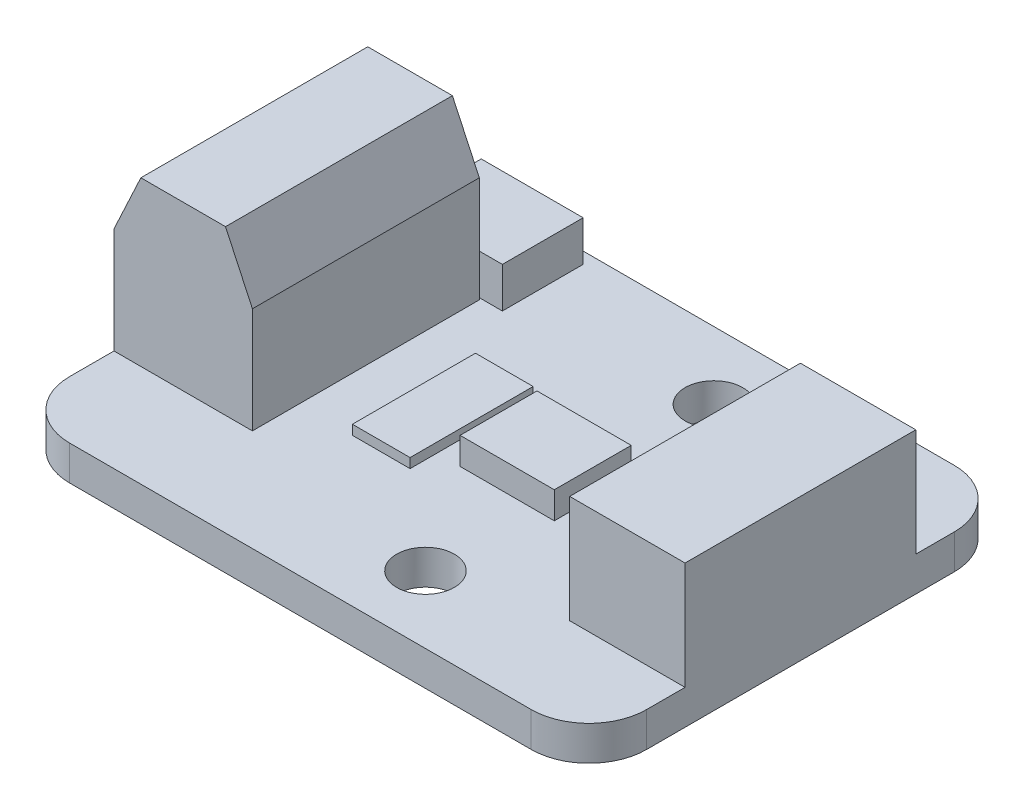
ISO-10303-21;
HEADER;
FILE_DESCRIPTION(('STEP AP214'),'2;1');
FILE_NAME('part.step','',(''),(''),'','','');
FILE_SCHEMA(('AUTOMOTIVE_DESIGN { 1 0 10303 214 1 1 1 1 }'));
ENDSEC;
DATA;
#1=APPLICATION_CONTEXT('core data for automotive mechanical design processes');
#2=APPLICATION_PROTOCOL_DEFINITION('international standard','automotive_design',2000,#1);
#3=PRODUCT_CONTEXT('',#1,'mechanical');
#4=PRODUCT('Part','Part','',(#3));
#5=PRODUCT_RELATED_PRODUCT_CATEGORY('part','',(#4));
#6=PRODUCT_DEFINITION_FORMATION('','',#4);
#7=PRODUCT_DEFINITION_CONTEXT('part definition',#1,'design');
#8=PRODUCT_DEFINITION('design','',#6,#7);
#9=PRODUCT_DEFINITION_SHAPE('','',#8);
#10=(LENGTH_UNIT() NAMED_UNIT(*) SI_UNIT(.MILLI.,.METRE.));
#11=(NAMED_UNIT(*) PLANE_ANGLE_UNIT() SI_UNIT($,.RADIAN.));
#12=(NAMED_UNIT(*) SI_UNIT($,.STERADIAN.) SOLID_ANGLE_UNIT());
#13=UNCERTAINTY_MEASURE_WITH_UNIT(LENGTH_MEASURE(1.E-05),#10,'distance_accuracy_value','');
#14=(GEOMETRIC_REPRESENTATION_CONTEXT(3) GLOBAL_UNCERTAINTY_ASSIGNED_CONTEXT((#13)) GLOBAL_UNIT_ASSIGNED_CONTEXT((#10,
#11,#12)) REPRESENTATION_CONTEXT('',''));
#15=CARTESIAN_POINT('',(0.,0.,0.));
#16=DIRECTION('',(0.,0.,1.));
#17=DIRECTION('',(1.,0.,0.));
#18=AXIS2_PLACEMENT_3D('',#15,#16,#17);
#19=CARTESIAN_POINT('',(0.,1.8,0.));
#20=DIRECTION('',(0.,-1.,0.));
#21=DIRECTION('',(0.,0.,-1.));
#22=AXIS2_PLACEMENT_3D('',#19,#20,#21);
#23=PLANE('',#22);
#24=DIRECTION('',(0.,0.,1.));
#25=VECTOR('',#24,1.);
#26=CARTESIAN_POINT('',(14.2,1.8,-13.1));
#27=LINE('',#26,#25);
#28=CARTESIAN_POINT('',(14.2,1.8,-13.1));
#29=VERTEX_POINT('',#28);
#30=CARTESIAN_POINT('',(14.2,1.8,-9.1));
#31=VERTEX_POINT('',#30);
#32=EDGE_CURVE('E262',#29,#31,#27,.T.);
#33=ORIENTED_EDGE('',*,*,#32,.F.);
#34=DIRECTION('',(-1.,0.,0.));
#35=VECTOR('',#34,1.);
#36=CARTESIAN_POINT('',(14.2,1.8,-13.1));
#37=LINE('',#36,#35);
#38=CARTESIAN_POINT('',(19.1,1.8,-13.1));
#39=VERTEX_POINT('',#38);
#40=EDGE_CURVE('E275',#39,#29,#37,.T.);
#41=ORIENTED_EDGE('',*,*,#40,.F.);
#42=DIRECTION('',(0.,0.,-1.));
#43=VECTOR('',#42,1.);
#44=CARTESIAN_POINT('',(19.1,1.8,-13.1));
#45=LINE('',#44,#43);
#46=CARTESIAN_POINT('',(19.1,1.8,-9.1));
#47=VERTEX_POINT('',#46);
#48=EDGE_CURVE('E284',#47,#39,#45,.T.);
#49=ORIENTED_EDGE('',*,*,#48,.F.);
#50=DIRECTION('',(1.,0.,0.));
#51=VECTOR('',#50,1.);
#52=CARTESIAN_POINT('',(14.2,1.8,-9.1));
#53=LINE('',#52,#51);
#54=EDGE_CURVE('E265',#31,#47,#53,.T.);
#55=ORIENTED_EDGE('',*,*,#54,.F.);
#56=EDGE_LOOP('',(#33,#41,#49,#55));
#57=FACE_BOUND('',#56,.T.);
#58=DIRECTION('',(-1.,0.,0.));
#59=VECTOR('',#58,1.);
#60=CARTESIAN_POINT('',(0.,1.8,-22.));
#61=LINE('',#60,#59);
#62=CARTESIAN_POINT('',(27.,1.8,-22.));
#63=VERTEX_POINT('',#62);
#64=CARTESIAN_POINT('',(3.,1.8,-22.));
#65=VERTEX_POINT('',#64);
#66=EDGE_CURVE('E409',#63,#65,#61,.T.);
#67=ORIENTED_EDGE('',*,*,#66,.T.);
#68=CARTESIAN_POINT('',(3.,1.8,-19.));
#69=DIRECTION('',(0.,-1.,0.));
#70=DIRECTION('',(0.,0.,-1.));
#71=AXIS2_PLACEMENT_3D('',#68,#69,#70);
#72=CIRCLE('',#71,3.);
#73=CARTESIAN_POINT('',(0.,1.8,-19.));
#74=VERTEX_POINT('',#73);
#75=EDGE_CURVE('E447',#65,#74,#72,.F.);
#76=ORIENTED_EDGE('',*,*,#75,.T.);
#77=DIRECTION('',(0.,0.,1.));
#78=VECTOR('',#77,1.);
#79=CARTESIAN_POINT('',(0.,1.8,0.));
#80=LINE('',#79,#78);
#81=CARTESIAN_POINT('',(0.,1.8,-17.1));
#82=VERTEX_POINT('',#81);
#83=EDGE_CURVE('E399',#74,#82,#80,.T.);
#84=ORIENTED_EDGE('',*,*,#83,.T.);
#85=DIRECTION('',(-1.,0.,0.));
#86=VECTOR('',#85,1.);
#87=CARTESIAN_POINT('',(0.,1.8,-17.1));
#88=LINE('',#87,#86);
#89=CARTESIAN_POINT('',(7.2,1.8,-17.1));
#90=VERTEX_POINT('',#89);
#91=EDGE_CURVE('E368',#90,#82,#88,.T.);
#92=ORIENTED_EDGE('',*,*,#91,.F.);
#93=DIRECTION('',(0.,0.,-1.));
#94=VECTOR('',#93,1.);
#95=CARTESIAN_POINT('',(7.2,1.8,-17.1));
#96=LINE('',#95,#94);
#97=CARTESIAN_POINT('',(7.2,1.8,-5.3));
#98=VERTEX_POINT('',#97);
#99=EDGE_CURVE('E374',#98,#90,#96,.T.);
#100=ORIENTED_EDGE('',*,*,#99,.F.);
#101=DIRECTION('',(1.,0.,0.));
#102=VECTOR('',#101,1.);
#103=CARTESIAN_POINT('',(0.,1.8,-5.3));
#104=LINE('',#103,#102);
#105=CARTESIAN_POINT('',(0.,1.8,-5.3));
#106=VERTEX_POINT('',#105);
#107=EDGE_CURVE('E363',#106,#98,#104,.T.);
#108=ORIENTED_EDGE('',*,*,#107,.F.);
#109=CARTESIAN_POINT('',(0.,1.8,-3.));
#110=VERTEX_POINT('',#109);
#111=EDGE_CURVE('E403',#106,#110,#80,.T.);
#112=ORIENTED_EDGE('',*,*,#111,.T.);
#113=CARTESIAN_POINT('',(3.,1.8,-3.));
#114=DIRECTION('',(0.,-1.,0.));
#115=DIRECTION('',(0.,0.,-1.));
#116=AXIS2_PLACEMENT_3D('',#113,#114,#115);
#117=CIRCLE('',#116,3.);
#118=CARTESIAN_POINT('',(3.,1.8,0.));
#119=VERTEX_POINT('',#118);
#120=EDGE_CURVE('E441',#110,#119,#117,.F.);
#121=ORIENTED_EDGE('',*,*,#120,.T.);
#122=DIRECTION('',(1.,0.,0.));
#123=VECTOR('',#122,1.);
#124=CARTESIAN_POINT('',(0.,1.8,0.));
#125=LINE('',#124,#123);
#126=CARTESIAN_POINT('',(27.,1.8,0.));
#127=VERTEX_POINT('',#126);
#128=EDGE_CURVE('E402',#119,#127,#125,.T.);
#129=ORIENTED_EDGE('',*,*,#128,.T.);
#130=CARTESIAN_POINT('',(27.,1.8,-3.));
#131=DIRECTION('',(0.,-1.,0.));
#132=DIRECTION('',(0.,0.,-1.));
#133=AXIS2_PLACEMENT_3D('',#130,#131,#132);
#134=CIRCLE('',#133,3.);
#135=CARTESIAN_POINT('',(30.,1.8,-3.));
#136=VERTEX_POINT('',#135);
#137=EDGE_CURVE('E443',#127,#136,#134,.F.);
#138=ORIENTED_EDGE('',*,*,#137,.T.);
#139=DIRECTION('',(0.,0.,-1.));
#140=VECTOR('',#139,1.);
#141=CARTESIAN_POINT('',(30.,1.8,0.));
#142=LINE('',#141,#140);
#143=CARTESIAN_POINT('',(30.,1.8,-5.));
#144=VERTEX_POINT('',#143);
#145=EDGE_CURVE('E407',#136,#144,#142,.T.);
#146=ORIENTED_EDGE('',*,*,#145,.T.);
#147=DIRECTION('',(1.,0.,0.));
#148=VECTOR('',#147,1.);
#149=CARTESIAN_POINT('',(24.,1.8,-5.));
#150=LINE('',#149,#148);
#151=CARTESIAN_POINT('',(24.,1.8,-5.));
#152=VERTEX_POINT('',#151);
#153=EDGE_CURVE('E347',#152,#144,#150,.T.);
#154=ORIENTED_EDGE('',*,*,#153,.F.);
#155=DIRECTION('',(0.,0.,1.));
#156=VECTOR('',#155,1.);
#157=CARTESIAN_POINT('',(24.,1.8,-17.));
#158=LINE('',#157,#156);
#159=CARTESIAN_POINT('',(24.,1.8,-17.));
#160=VERTEX_POINT('',#159);
#161=EDGE_CURVE('E333',#160,#152,#158,.T.);
#162=ORIENTED_EDGE('',*,*,#161,.F.);
#163=DIRECTION('',(-1.,0.,0.));
#164=VECTOR('',#163,1.);
#165=CARTESIAN_POINT('',(24.,1.8,-17.));
#166=LINE('',#165,#164);
#167=CARTESIAN_POINT('',(30.,1.8,-17.));
#168=VERTEX_POINT('',#167);
#169=EDGE_CURVE('E338',#168,#160,#166,.T.);
#170=ORIENTED_EDGE('',*,*,#169,.F.);
#171=CARTESIAN_POINT('',(30.,1.8,-19.));
#172=VERTEX_POINT('',#171);
#173=EDGE_CURVE('E406',#168,#172,#142,.T.);
#174=ORIENTED_EDGE('',*,*,#173,.T.);
#175=CARTESIAN_POINT('',(27.,1.8,-19.));
#176=DIRECTION('',(0.,-1.,0.));
#177=DIRECTION('',(0.,0.,-1.));
#178=AXIS2_PLACEMENT_3D('',#175,#176,#177);
#179=CIRCLE('',#178,3.);
#180=EDGE_CURVE('E445',#172,#63,#179,.F.);
#181=ORIENTED_EDGE('',*,*,#180,.T.);
#182=EDGE_LOOP('',(#67,#76,#84,#92,#100,#108,#112,#121,#129,#138,#146,#154,#162,#170,#174,#181));
#183=FACE_BOUND('',#182,.T.);
#184=CARTESIAN_POINT('',(18.,1.8,-3.5));
#185=DIRECTION('',(0.,1.,0.));
#186=DIRECTION('',(0.,0.,1.));
#187=AXIS2_PLACEMENT_3D('',#184,#185,#186);
#188=CIRCLE('',#187,1.5);
#189=CARTESIAN_POINT('',(18.,1.8,-2.));
#190=VERTEX_POINT('',#189);
#191=EDGE_CURVE('E391',#190,#190,#188,.T.);
#192=ORIENTED_EDGE('',*,*,#191,.F.);
#193=EDGE_LOOP('',(#192));
#194=FACE_BOUND('',#193,.T.);
#195=CARTESIAN_POINT('',(18.,1.8,-18.5));
#196=DIRECTION('',(0.,1.,0.));
#197=DIRECTION('',(0.,0.,1.));
#198=AXIS2_PLACEMENT_3D('',#195,#196,#197);
#199=CIRCLE('',#198,1.5);
#200=CARTESIAN_POINT('',(18.,1.8,-17.));
#201=VERTEX_POINT('',#200);
#202=EDGE_CURVE('E387',#201,#201,#199,.T.);
#203=ORIENTED_EDGE('',*,*,#202,.F.);
#204=EDGE_LOOP('',(#203));
#205=FACE_BOUND('',#204,.T.);
#206=DIRECTION('',(0.,0.,1.));
#207=VECTOR('',#206,1.);
#208=CARTESIAN_POINT('',(3.,1.8,-21.4));
#209=LINE('',#208,#207);
#210=CARTESIAN_POINT('',(3.,1.8,-21.4));
#211=VERTEX_POINT('',#210);
#212=CARTESIAN_POINT('',(3.,1.8,-17.2));
#213=VERTEX_POINT('',#212);
#214=EDGE_CURVE('E300',#211,#213,#209,.T.);
#215=ORIENTED_EDGE('',*,*,#214,.F.);
#216=DIRECTION('',(-1.,0.,0.));
#217=VECTOR('',#216,1.);
#218=CARTESIAN_POINT('',(3.,1.8,-21.4));
#219=LINE('',#218,#217);
#220=CARTESIAN_POINT('',(8.3,1.8,-21.4));
#221=VERTEX_POINT('',#220);
#222=EDGE_CURVE('E305',#221,#211,#219,.T.);
#223=ORIENTED_EDGE('',*,*,#222,.F.);
#224=DIRECTION('',(0.,0.,-1.));
#225=VECTOR('',#224,1.);
#226=CARTESIAN_POINT('',(8.3,1.8,-21.4));
#227=LINE('',#226,#225);
#228=CARTESIAN_POINT('',(8.3,1.8,-17.2));
#229=VERTEX_POINT('',#228);
#230=EDGE_CURVE('E317',#229,#221,#227,.T.);
#231=ORIENTED_EDGE('',*,*,#230,.F.);
#232=DIRECTION('',(1.,0.,0.));
#233=VECTOR('',#232,1.);
#234=CARTESIAN_POINT('',(3.,1.8,-17.2));
#235=LINE('',#234,#233);
#236=EDGE_CURVE('E314',#213,#229,#235,.T.);
#237=ORIENTED_EDGE('',*,*,#236,.F.);
#238=EDGE_LOOP('',(#215,#223,#231,#237));
#239=FACE_BOUND('',#238,.T.);
#240=DIRECTION('',(0.,0.,1.));
#241=VECTOR('',#240,1.);
#242=CARTESIAN_POINT('',(10.,1.8,-14.1));
#243=LINE('',#242,#241);
#244=CARTESIAN_POINT('',(10.,1.8,-14.1));
#245=VERTEX_POINT('',#244);
#246=CARTESIAN_POINT('',(10.,1.8,-7.7));
#247=VERTEX_POINT('',#246);
#248=EDGE_CURVE('E261',#245,#247,#243,.T.);
#249=ORIENTED_EDGE('',*,*,#248,.F.);
#250=DIRECTION('',(-1.,0.,0.));
#251=VECTOR('',#250,1.);
#252=CARTESIAN_POINT('',(10.,1.8,-14.1));
#253=LINE('',#252,#251);
#254=CARTESIAN_POINT('',(13.,1.8,-14.1));
#255=VERTEX_POINT('',#254);
#256=EDGE_CURVE('E258',#255,#245,#253,.T.);
#257=ORIENTED_EDGE('',*,*,#256,.F.);
#258=DIRECTION('',(0.,0.,-1.));
#259=VECTOR('',#258,1.);
#260=CARTESIAN_POINT('',(13.,1.8,-14.1));
#261=LINE('',#260,#259);
#262=CARTESIAN_POINT('',(13.,1.8,-7.7));
#263=VERTEX_POINT('',#262);
#264=EDGE_CURVE('E954',#263,#255,#261,.T.);
#265=ORIENTED_EDGE('',*,*,#264,.F.);
#266=DIRECTION('',(1.,0.,0.));
#267=VECTOR('',#266,1.);
#268=CARTESIAN_POINT('',(10.,1.8,-7.7));
#269=LINE('',#268,#267);
#270=EDGE_CURVE('E960',#247,#263,#269,.T.);
#271=ORIENTED_EDGE('',*,*,#270,.F.);
#272=EDGE_LOOP('',(#249,#257,#265,#271));
#273=FACE_BOUND('',#272,.T.);
#274=ADVANCED_FACE('F39',(#57,#183,#194,#205,#239,#273),#23,.F.);
#275=CARTESIAN_POINT('',(0.,1.8,0.));
#276=DIRECTION('',(1.,0.,0.));
#277=DIRECTION('',(0.,0.,-1.));
#278=AXIS2_PLACEMENT_3D('',#275,#276,#277);
#279=PLANE('',#278);
#280=DIRECTION('',(0.,-1.,0.));
#281=VECTOR('',#280,1.);
#282=CARTESIAN_POINT('',(0.,10.3,-5.3));
#283=LINE('',#282,#281);
#284=CARTESIAN_POINT('',(0.,7.29999999999997,-5.3));
#285=VERTEX_POINT('',#284);
#286=EDGE_CURVE('E384',#285,#106,#283,.T.);
#287=ORIENTED_EDGE('',*,*,#286,.F.);
#288=DIRECTION('',(0.,0.,-1.));
#289=VECTOR('',#288,1.);
#290=CARTESIAN_POINT('',(0.,7.29999999999997,-17.1));
#291=LINE('',#290,#289);
#292=CARTESIAN_POINT('',(0.,7.29999999999997,-17.1));
#293=VERTEX_POINT('',#292);
#294=EDGE_CURVE('E11',#285,#293,#291,.T.);
#295=ORIENTED_EDGE('',*,*,#294,.T.);
#296=DIRECTION('',(0.,-1.,0.));
#297=VECTOR('',#296,1.);
#298=CARTESIAN_POINT('',(0.,10.3,-17.1));
#299=LINE('',#298,#297);
#300=EDGE_CURVE('E371',#293,#82,#299,.T.);
#301=ORIENTED_EDGE('',*,*,#300,.T.);
#302=ORIENTED_EDGE('',*,*,#83,.F.);
#303=DIRECTION('',(0.,-1.,0.));
#304=VECTOR('',#303,1.);
#305=CARTESIAN_POINT('',(0.,1.8,-19.));
#306=LINE('',#305,#304);
#307=CARTESIAN_POINT('',(0.,0.,-19.));
#308=VERTEX_POINT('',#307);
#309=EDGE_CURVE('E425',#74,#308,#306,.T.);
#310=ORIENTED_EDGE('',*,*,#309,.T.);
#311=DIRECTION('',(0.,0.,1.));
#312=VECTOR('',#311,1.);
#313=CARTESIAN_POINT('',(0.,0.,0.));
#314=LINE('',#313,#312);
#315=CARTESIAN_POINT('',(0.,0.,-3.));
#316=VERTEX_POINT('',#315);
#317=EDGE_CURVE('E394',#308,#316,#314,.T.);
#318=ORIENTED_EDGE('',*,*,#317,.T.);
#319=DIRECTION('',(0.,-1.,0.));
#320=VECTOR('',#319,1.);
#321=CARTESIAN_POINT('',(0.,1.8,-3.));
#322=LINE('',#321,#320);
#323=EDGE_CURVE('E412',#316,#110,#322,.F.);
#324=ORIENTED_EDGE('',*,*,#323,.T.);
#325=ORIENTED_EDGE('',*,*,#111,.F.);
#326=EDGE_LOOP('',(#287,#295,#301,#302,#310,#318,#324,#325));
#327=FACE_BOUND('',#326,.T.);
#328=ADVANCED_FACE('F491',(#327),#279,.F.);
#329=CARTESIAN_POINT('',(0.,1.8,0.));
#330=DIRECTION('',(0.,0.,-1.));
#331=DIRECTION('',(-1.,0.,0.));
#332=AXIS2_PLACEMENT_3D('',#329,#330,#331);
#333=PLANE('',#332);
#334=DIRECTION('',(1.,0.,0.));
#335=VECTOR('',#334,1.);
#336=CARTESIAN_POINT('',(0.,0.,0.));
#337=LINE('',#336,#335);
#338=CARTESIAN_POINT('',(3.,0.,0.));
#339=VERTEX_POINT('',#338);
#340=CARTESIAN_POINT('',(27.,0.,0.));
#341=VERTEX_POINT('',#340);
#342=EDGE_CURVE('E415',#339,#341,#337,.T.);
#343=ORIENTED_EDGE('',*,*,#342,.T.);
#344=DIRECTION('',(0.,-1.,0.));
#345=VECTOR('',#344,1.);
#346=CARTESIAN_POINT('',(27.,1.8,0.));
#347=LINE('',#346,#345);
#348=EDGE_CURVE('E457',#341,#127,#347,.F.);
#349=ORIENTED_EDGE('',*,*,#348,.T.);
#350=ORIENTED_EDGE('',*,*,#128,.F.);
#351=DIRECTION('',(0.,-1.,0.));
#352=VECTOR('',#351,1.);
#353=CARTESIAN_POINT('',(3.,1.8,0.));
#354=LINE('',#353,#352);
#355=EDGE_CURVE('E454',#119,#339,#354,.T.);
#356=ORIENTED_EDGE('',*,*,#355,.T.);
#357=EDGE_LOOP('',(#343,#349,#350,#356));
#358=FACE_BOUND('',#357,.T.);
#359=ADVANCED_FACE('F514',(#358),#333,.F.);
#360=CARTESIAN_POINT('',(30.,1.8,0.));
#361=DIRECTION('',(-1.,0.,0.));
#362=DIRECTION('',(0.,0.,1.));
#363=AXIS2_PLACEMENT_3D('',#360,#361,#362);
#364=PLANE('',#363);
#365=DIRECTION('',(0.,0.,-1.));
#366=VECTOR('',#365,1.);
#367=CARTESIAN_POINT('',(30.,0.,0.));
#368=LINE('',#367,#366);
#369=CARTESIAN_POINT('',(30.,0.,-3.));
#370=VERTEX_POINT('',#369);
#371=CARTESIAN_POINT('',(30.,0.,-19.));
#372=VERTEX_POINT('',#371);
#373=EDGE_CURVE('E418',#370,#372,#368,.T.);
#374=ORIENTED_EDGE('',*,*,#373,.T.);
#375=DIRECTION('',(0.,-1.,0.));
#376=VECTOR('',#375,1.);
#377=CARTESIAN_POINT('',(30.,1.8,-19.));
#378=LINE('',#377,#376);
#379=EDGE_CURVE('E452',#372,#172,#378,.F.);
#380=ORIENTED_EDGE('',*,*,#379,.T.);
#381=ORIENTED_EDGE('',*,*,#173,.F.);
#382=DIRECTION('',(0.,-1.,0.));
#383=VECTOR('',#382,1.);
#384=CARTESIAN_POINT('',(30.,7.4,-17.));
#385=LINE('',#384,#383);
#386=CARTESIAN_POINT('',(30.,7.4,-17.));
#387=VERTEX_POINT('',#386);
#388=EDGE_CURVE('E354',#387,#168,#385,.T.);
#389=ORIENTED_EDGE('',*,*,#388,.F.);
#390=DIRECTION('',(0.,0.,-1.));
#391=VECTOR('',#390,1.);
#392=CARTESIAN_POINT('',(30.,7.4,-17.));
#393=LINE('',#392,#391);
#394=CARTESIAN_POINT('',(30.,7.4,-5.));
#395=VERTEX_POINT('',#394);
#396=EDGE_CURVE('E340',#395,#387,#393,.T.);
#397=ORIENTED_EDGE('',*,*,#396,.F.);
#398=DIRECTION('',(0.,-1.,0.));
#399=VECTOR('',#398,1.);
#400=CARTESIAN_POINT('',(30.,7.4,-5.));
#401=LINE('',#400,#399);
#402=EDGE_CURVE('E357',#395,#144,#401,.T.);
#403=ORIENTED_EDGE('',*,*,#402,.T.);
#404=ORIENTED_EDGE('',*,*,#145,.F.);
#405=DIRECTION('',(0.,-1.,0.));
#406=VECTOR('',#405,1.);
#407=CARTESIAN_POINT('',(30.,1.8,-3.));
#408=LINE('',#407,#406);
#409=EDGE_CURVE('E449',#136,#370,#408,.T.);
#410=ORIENTED_EDGE('',*,*,#409,.T.);
#411=EDGE_LOOP('',(#374,#380,#381,#389,#397,#403,#404,#410));
#412=FACE_BOUND('',#411,.T.);
#413=ADVANCED_FACE('F523',(#412),#364,.F.);
#414=CARTESIAN_POINT('',(0.,1.8,-22.));
#415=DIRECTION('',(0.,0.,1.));
#416=DIRECTION('',(1.,0.,0.));
#417=AXIS2_PLACEMENT_3D('',#414,#415,#416);
#418=PLANE('',#417);
#419=DIRECTION('',(-1.,0.,0.));
#420=VECTOR('',#419,1.);
#421=CARTESIAN_POINT('',(0.,0.,-22.));
#422=LINE('',#421,#420);
#423=CARTESIAN_POINT('',(27.,0.,-22.));
#424=VERTEX_POINT('',#423);
#425=CARTESIAN_POINT('',(3.,0.,-22.));
#426=VERTEX_POINT('',#425);
#427=EDGE_CURVE('E421',#424,#426,#422,.T.);
#428=ORIENTED_EDGE('',*,*,#427,.T.);
#429=DIRECTION('',(0.,-1.,0.));
#430=VECTOR('',#429,1.);
#431=CARTESIAN_POINT('',(3.,1.8,-22.));
#432=LINE('',#431,#430);
#433=EDGE_CURVE('E439',#426,#65,#432,.F.);
#434=ORIENTED_EDGE('',*,*,#433,.T.);
#435=ORIENTED_EDGE('',*,*,#66,.F.);
#436=DIRECTION('',(0.,-1.,0.));
#437=VECTOR('',#436,1.);
#438=CARTESIAN_POINT('',(27.,1.8,-22.));
#439=LINE('',#438,#437);
#440=EDGE_CURVE('E436',#63,#424,#439,.T.);
#441=ORIENTED_EDGE('',*,*,#440,.T.);
#442=EDGE_LOOP('',(#428,#434,#435,#441));
#443=FACE_BOUND('',#442,.T.);
#444=ADVANCED_FACE('F530',(#443),#418,.F.);
#445=CARTESIAN_POINT('',(0.,0.,0.));
#446=DIRECTION('',(0.,-1.,0.));
#447=DIRECTION('',(0.,0.,-1.));
#448=AXIS2_PLACEMENT_3D('',#445,#446,#447);
#449=PLANE('',#448);
#450=CARTESIAN_POINT('',(18.,0.,-18.5));
#451=DIRECTION('',(0.,-1.,0.));
#452=DIRECTION('',(0.,0.,-1.));
#453=AXIS2_PLACEMENT_3D('',#450,#451,#452);
#454=CIRCLE('',#453,1.5);
#455=CARTESIAN_POINT('',(18.,0.,-20.));
#456=VERTEX_POINT('',#455);
#457=EDGE_CURVE('E390',#456,#456,#454,.F.);
#458=ORIENTED_EDGE('',*,*,#457,.T.);
#459=EDGE_LOOP('',(#458));
#460=FACE_BOUND('',#459,.T.);
#461=CARTESIAN_POINT('',(18.,0.,-3.5));
#462=DIRECTION('',(0.,-1.,0.));
#463=DIRECTION('',(0.,0.,-1.));
#464=AXIS2_PLACEMENT_3D('',#461,#462,#463);
#465=CIRCLE('',#464,1.5);
#466=CARTESIAN_POINT('',(18.,0.,-5.));
#467=VERTEX_POINT('',#466);
#468=EDGE_CURVE('E386',#467,#467,#465,.F.);
#469=ORIENTED_EDGE('',*,*,#468,.T.);
#470=EDGE_LOOP('',(#469));
#471=FACE_BOUND('',#470,.T.);
#472=ORIENTED_EDGE('',*,*,#317,.F.);
#473=CARTESIAN_POINT('',(3.,0.,-19.));
#474=DIRECTION('',(0.,-1.,0.));
#475=DIRECTION('',(0.,0.,-1.));
#476=AXIS2_PLACEMENT_3D('',#473,#474,#475);
#477=CIRCLE('',#476,3.);
#478=EDGE_CURVE('E434',#308,#426,#477,.T.);
#479=ORIENTED_EDGE('',*,*,#478,.T.);
#480=ORIENTED_EDGE('',*,*,#427,.F.);
#481=CARTESIAN_POINT('',(27.,0.,-19.));
#482=DIRECTION('',(0.,-1.,0.));
#483=DIRECTION('',(0.,0.,-1.));
#484=AXIS2_PLACEMENT_3D('',#481,#482,#483);
#485=CIRCLE('',#484,3.);
#486=EDGE_CURVE('E432',#424,#372,#485,.T.);
#487=ORIENTED_EDGE('',*,*,#486,.T.);
#488=ORIENTED_EDGE('',*,*,#373,.F.);
#489=CARTESIAN_POINT('',(27.,0.,-3.));
#490=DIRECTION('',(0.,-1.,0.));
#491=DIRECTION('',(0.,0.,-1.));
#492=AXIS2_PLACEMENT_3D('',#489,#490,#491);
#493=CIRCLE('',#492,3.);
#494=EDGE_CURVE('E430',#370,#341,#493,.T.);
#495=ORIENTED_EDGE('',*,*,#494,.T.);
#496=ORIENTED_EDGE('',*,*,#342,.F.);
#497=CARTESIAN_POINT('',(3.,0.,-3.));
#498=DIRECTION('',(0.,-1.,0.));
#499=DIRECTION('',(0.,0.,-1.));
#500=AXIS2_PLACEMENT_3D('',#497,#498,#499);
#501=CIRCLE('',#500,3.);
#502=EDGE_CURVE('E428',#339,#316,#501,.T.);
#503=ORIENTED_EDGE('',*,*,#502,.T.);
#504=EDGE_LOOP('',(#472,#479,#480,#487,#488,#495,#496,#503));
#505=FACE_BOUND('',#504,.T.);
#506=ADVANCED_FACE('F505',(#460,#471,#505),#449,.T.);
#507=CARTESIAN_POINT('',(18.,-4.24264068711929,-3.5));
#508=DIRECTION('',(0.,1.,0.));
#509=DIRECTION('',(0.,0.,1.));
#510=AXIS2_PLACEMENT_3D('',#507,#508,#509);
#511=CYLINDRICAL_SURFACE('',#510,1.5);
#512=ORIENTED_EDGE('',*,*,#191,.T.);
#513=EDGE_LOOP('',(#512));
#514=FACE_BOUND('',#513,.T.);
#515=ORIENTED_EDGE('',*,*,#468,.F.);
#516=EDGE_LOOP('',(#515));
#517=FACE_BOUND('',#516,.T.);
#518=ADVANCED_FACE('F537',(#514,#517),#511,.F.);
#519=CARTESIAN_POINT('',(18.,-4.24264068711929,-18.5));
#520=DIRECTION('',(0.,1.,0.));
#521=DIRECTION('',(0.,0.,1.));
#522=AXIS2_PLACEMENT_3D('',#519,#520,#521);
#523=CYLINDRICAL_SURFACE('',#522,1.5);
#524=ORIENTED_EDGE('',*,*,#202,.T.);
#525=EDGE_LOOP('',(#524));
#526=FACE_BOUND('',#525,.T.);
#527=ORIENTED_EDGE('',*,*,#457,.F.);
#528=EDGE_LOOP('',(#527));
#529=FACE_BOUND('',#528,.T.);
#530=ADVANCED_FACE('F551',(#526,#529),#523,.F.);
#531=CARTESIAN_POINT('',(0.,10.3,-5.3));
#532=DIRECTION('',(0.,0.,-1.));
#533=DIRECTION('',(-1.,0.,0.));
#534=AXIS2_PLACEMENT_3D('',#531,#532,#533);
#535=PLANE('',#534);
#536=DIRECTION('',(0.,-1.,0.));
#537=VECTOR('',#536,1.);
#538=CARTESIAN_POINT('',(7.2,10.3,-5.3));
#539=LINE('',#538,#537);
#540=CARTESIAN_POINT('',(7.2,7.29999999999998,-5.3));
#541=VERTEX_POINT('',#540);
#542=EDGE_CURVE('E382',#541,#98,#539,.T.);
#543=ORIENTED_EDGE('',*,*,#542,.F.);
#544=DIRECTION('',(-0.422618261740697,0.906307787036651,0.));
#545=VECTOR('',#544,1.);
#546=CARTESIAN_POINT('',(5.80107702553501,10.3,-5.3));
#547=LINE('',#546,#545);
#548=CARTESIAN_POINT('',(5.80107702553501,10.3,-5.3));
#549=VERTEX_POINT('',#548);
#550=EDGE_CURVE('E48',#541,#549,#547,.T.);
#551=ORIENTED_EDGE('',*,*,#550,.T.);
#552=DIRECTION('',(1.,0.,0.));
#553=VECTOR('',#552,1.);
#554=CARTESIAN_POINT('',(0.,10.3,-5.3));
#555=LINE('',#554,#553);
#556=CARTESIAN_POINT('',(1.398922974465,10.3,-5.3));
#557=VERTEX_POINT('',#556);
#558=EDGE_CURVE('E364',#557,#549,#555,.T.);
#559=ORIENTED_EDGE('',*,*,#558,.F.);
#560=DIRECTION('',(-0.422618261740697,-0.906307787036651,0.));
#561=VECTOR('',#560,1.);
#562=CARTESIAN_POINT('',(1.398922974465,10.3,-5.3));
#563=LINE('',#562,#561);
#564=EDGE_CURVE('E55',#557,#285,#563,.T.);
#565=ORIENTED_EDGE('',*,*,#564,.T.);
#566=ORIENTED_EDGE('',*,*,#286,.T.);
#567=ORIENTED_EDGE('',*,*,#107,.T.);
#568=EDGE_LOOP('',(#543,#551,#559,#565,#566,#567));
#569=FACE_BOUND('',#568,.T.);
#570=ADVANCED_FACE('F471',(#569),#535,.F.);
#571=CARTESIAN_POINT('',(7.2,10.3,-17.1));
#572=DIRECTION('',(-1.,0.,0.));
#573=DIRECTION('',(0.,0.,1.));
#574=AXIS2_PLACEMENT_3D('',#571,#572,#573);
#575=PLANE('',#574);
#576=DIRECTION('',(0.,-1.,0.));
#577=VECTOR('',#576,1.);
#578=CARTESIAN_POINT('',(7.2,10.3,-17.1));
#579=LINE('',#578,#577);
#580=CARTESIAN_POINT('',(7.2,7.29999999999998,-17.1));
#581=VERTEX_POINT('',#580);
#582=EDGE_CURVE('E380',#581,#90,#579,.T.);
#583=ORIENTED_EDGE('',*,*,#582,.F.);
#584=DIRECTION('',(0.,0.,1.));
#585=VECTOR('',#584,1.);
#586=CARTESIAN_POINT('',(7.2,7.29999999999998,-5.3));
#587=LINE('',#586,#585);
#588=EDGE_CURVE('E63',#581,#541,#587,.T.);
#589=ORIENTED_EDGE('',*,*,#588,.T.);
#590=ORIENTED_EDGE('',*,*,#542,.T.);
#591=ORIENTED_EDGE('',*,*,#99,.T.);
#592=EDGE_LOOP('',(#583,#589,#590,#591));
#593=FACE_BOUND('',#592,.T.);
#594=ADVANCED_FACE('F482',(#593),#575,.F.);
#595=CARTESIAN_POINT('',(0.,10.3,-17.1));
#596=DIRECTION('',(0.,0.,1.));
#597=DIRECTION('',(1.,0.,0.));
#598=AXIS2_PLACEMENT_3D('',#595,#596,#597);
#599=PLANE('',#598);
#600=DIRECTION('',(-1.,0.,0.));
#601=VECTOR('',#600,1.);
#602=CARTESIAN_POINT('',(0.,10.3,-17.1));
#603=LINE('',#602,#601);
#604=CARTESIAN_POINT('',(5.801077025535,10.3,-17.1));
#605=VERTEX_POINT('',#604);
#606=CARTESIAN_POINT('',(1.398922974465,10.3,-17.1));
#607=VERTEX_POINT('',#606);
#608=EDGE_CURVE('E367',#605,#607,#603,.T.);
#609=ORIENTED_EDGE('',*,*,#608,.F.);
#610=DIRECTION('',(0.422618261740697,-0.906307787036651,0.));
#611=VECTOR('',#610,1.);
#612=CARTESIAN_POINT('',(5.80107702553501,10.3,-17.1));
#613=LINE('',#612,#611);
#614=EDGE_CURVE('E467',#605,#581,#613,.T.);
#615=ORIENTED_EDGE('',*,*,#614,.T.);
#616=ORIENTED_EDGE('',*,*,#582,.T.);
#617=ORIENTED_EDGE('',*,*,#91,.T.);
#618=ORIENTED_EDGE('',*,*,#300,.F.);
#619=DIRECTION('',(0.422618261740697,0.906307787036651,0.));
#620=VECTOR('',#619,1.);
#621=CARTESIAN_POINT('',(1.398922974465,10.3,-17.1));
#622=LINE('',#621,#620);
#623=EDGE_CURVE('E465',#293,#607,#622,.T.);
#624=ORIENTED_EDGE('',*,*,#623,.T.);
#625=EDGE_LOOP('',(#609,#615,#616,#617,#618,#624));
#626=FACE_BOUND('',#625,.T.);
#627=ADVANCED_FACE('F480',(#626),#599,.F.);
#628=CARTESIAN_POINT('',(0.,10.3,0.));
#629=DIRECTION('',(0.,1.,0.));
#630=DIRECTION('',(0.,0.,1.));
#631=AXIS2_PLACEMENT_3D('',#628,#629,#630);
#632=PLANE('',#631);
#633=ORIENTED_EDGE('',*,*,#558,.T.);
#634=DIRECTION('',(0.,0.,-1.));
#635=VECTOR('',#634,1.);
#636=CARTESIAN_POINT('',(5.801077025535,10.3,-17.1));
#637=LINE('',#636,#635);
#638=EDGE_CURVE('E462',#549,#605,#637,.T.);
#639=ORIENTED_EDGE('',*,*,#638,.T.);
#640=ORIENTED_EDGE('',*,*,#608,.T.);
#641=DIRECTION('',(0.,0.,1.));
#642=VECTOR('',#641,1.);
#643=CARTESIAN_POINT('',(1.398922974465,10.3,-5.3));
#644=LINE('',#643,#642);
#645=EDGE_CURVE('E459',#607,#557,#644,.T.);
#646=ORIENTED_EDGE('',*,*,#645,.T.);
#647=EDGE_LOOP('',(#633,#639,#640,#646));
#648=FACE_BOUND('',#647,.T.);
#649=ADVANCED_FACE('F475',(#648),#632,.T.);
#650=CARTESIAN_POINT('',(24.,7.4,-17.));
#651=DIRECTION('',(1.,0.,0.));
#652=DIRECTION('',(0.,0.,-1.));
#653=AXIS2_PLACEMENT_3D('',#650,#651,#652);
#654=PLANE('',#653);
#655=ORIENTED_EDGE('',*,*,#161,.T.);
#656=DIRECTION('',(0.,-1.,0.));
#657=VECTOR('',#656,1.);
#658=CARTESIAN_POINT('',(24.,7.4,-5.));
#659=LINE('',#658,#657);
#660=CARTESIAN_POINT('',(24.,7.4,-5.));
#661=VERTEX_POINT('',#660);
#662=EDGE_CURVE('E360',#661,#152,#659,.T.);
#663=ORIENTED_EDGE('',*,*,#662,.F.);
#664=DIRECTION('',(0.,0.,1.));
#665=VECTOR('',#664,1.);
#666=CARTESIAN_POINT('',(24.,7.4,-17.));
#667=LINE('',#666,#665);
#668=CARTESIAN_POINT('',(24.,7.4,-17.));
#669=VERTEX_POINT('',#668);
#670=EDGE_CURVE('E334',#669,#661,#667,.T.);
#671=ORIENTED_EDGE('',*,*,#670,.F.);
#672=DIRECTION('',(0.,-1.,0.));
#673=VECTOR('',#672,1.);
#674=CARTESIAN_POINT('',(24.,7.4,-17.));
#675=LINE('',#674,#673);
#676=EDGE_CURVE('E344',#669,#160,#675,.T.);
#677=ORIENTED_EDGE('',*,*,#676,.T.);
#678=EDGE_LOOP('',(#655,#663,#671,#677));
#679=FACE_BOUND('',#678,.T.);
#680=ADVANCED_FACE('F564',(#679),#654,.F.);
#681=CARTESIAN_POINT('',(24.,7.4,-5.));
#682=DIRECTION('',(0.,0.,-1.));
#683=DIRECTION('',(-1.,0.,0.));
#684=AXIS2_PLACEMENT_3D('',#681,#682,#683);
#685=PLANE('',#684);
#686=ORIENTED_EDGE('',*,*,#153,.T.);
#687=ORIENTED_EDGE('',*,*,#402,.F.);
#688=DIRECTION('',(1.,0.,0.));
#689=VECTOR('',#688,1.);
#690=CARTESIAN_POINT('',(24.,7.4,-5.));
#691=LINE('',#690,#689);
#692=EDGE_CURVE('E337',#661,#395,#691,.T.);
#693=ORIENTED_EDGE('',*,*,#692,.F.);
#694=ORIENTED_EDGE('',*,*,#662,.T.);
#695=EDGE_LOOP('',(#686,#687,#693,#694));
#696=FACE_BOUND('',#695,.T.);
#697=ADVANCED_FACE('F567',(#696),#685,.F.);
#698=CARTESIAN_POINT('',(24.,7.4,-17.));
#699=DIRECTION('',(0.,0.,1.));
#700=DIRECTION('',(1.,0.,0.));
#701=AXIS2_PLACEMENT_3D('',#698,#699,#700);
#702=PLANE('',#701);
#703=ORIENTED_EDGE('',*,*,#169,.T.);
#704=ORIENTED_EDGE('',*,*,#676,.F.);
#705=DIRECTION('',(-1.,0.,0.));
#706=VECTOR('',#705,1.);
#707=CARTESIAN_POINT('',(24.,7.4,-17.));
#708=LINE('',#707,#706);
#709=EDGE_CURVE('E342',#387,#669,#708,.T.);
#710=ORIENTED_EDGE('',*,*,#709,.F.);
#711=ORIENTED_EDGE('',*,*,#388,.T.);
#712=EDGE_LOOP('',(#703,#704,#710,#711));
#713=FACE_BOUND('',#712,.T.);
#714=ADVANCED_FACE('F571',(#713),#702,.F.);
#715=CARTESIAN_POINT('',(0.,7.4,0.));
#716=DIRECTION('',(0.,1.,0.));
#717=DIRECTION('',(0.,0.,1.));
#718=AXIS2_PLACEMENT_3D('',#715,#716,#717);
#719=PLANE('',#718);
#720=ORIENTED_EDGE('',*,*,#670,.T.);
#721=ORIENTED_EDGE('',*,*,#692,.T.);
#722=ORIENTED_EDGE('',*,*,#396,.T.);
#723=ORIENTED_EDGE('',*,*,#709,.T.);
#724=EDGE_LOOP('',(#720,#721,#722,#723));
#725=FACE_BOUND('',#724,.T.);
#726=ADVANCED_FACE('F575',(#725),#719,.T.);
#727=CARTESIAN_POINT('',(3.,3.9,-21.4));
#728=DIRECTION('',(1.,0.,0.));
#729=DIRECTION('',(0.,0.,-1.));
#730=AXIS2_PLACEMENT_3D('',#727,#728,#729);
#731=PLANE('',#730);
#732=ORIENTED_EDGE('',*,*,#214,.T.);
#733=DIRECTION('',(0.,-1.,0.));
#734=VECTOR('',#733,1.);
#735=CARTESIAN_POINT('',(3.,3.9,-17.2));
#736=LINE('',#735,#734);
#737=CARTESIAN_POINT('',(3.,3.9,-17.2));
#738=VERTEX_POINT('',#737);
#739=EDGE_CURVE('E330',#738,#213,#736,.T.);
#740=ORIENTED_EDGE('',*,*,#739,.F.);
#741=DIRECTION('',(0.,0.,1.));
#742=VECTOR('',#741,1.);
#743=CARTESIAN_POINT('',(3.,3.9,-21.4));
#744=LINE('',#743,#742);
#745=CARTESIAN_POINT('',(3.,3.9,-21.4));
#746=VERTEX_POINT('',#745);
#747=EDGE_CURVE('E301',#746,#738,#744,.T.);
#748=ORIENTED_EDGE('',*,*,#747,.F.);
#749=DIRECTION('',(0.,-1.,0.));
#750=VECTOR('',#749,1.);
#751=CARTESIAN_POINT('',(3.,3.9,-21.4));
#752=LINE('',#751,#750);
#753=EDGE_CURVE('E311',#746,#211,#752,.T.);
#754=ORIENTED_EDGE('',*,*,#753,.T.);
#755=EDGE_LOOP('',(#732,#740,#748,#754));
#756=FACE_BOUND('',#755,.T.);
#757=ADVANCED_FACE('F579',(#756),#731,.F.);
#758=CARTESIAN_POINT('',(3.,3.9,-17.2));
#759=DIRECTION('',(0.,0.,-1.));
#760=DIRECTION('',(-1.,0.,0.));
#761=AXIS2_PLACEMENT_3D('',#758,#759,#760);
#762=PLANE('',#761);
#763=ORIENTED_EDGE('',*,*,#236,.T.);
#764=DIRECTION('',(0.,-1.,0.));
#765=VECTOR('',#764,1.);
#766=CARTESIAN_POINT('',(8.3,3.9,-17.2));
#767=LINE('',#766,#765);
#768=CARTESIAN_POINT('',(8.3,3.9,-17.2));
#769=VERTEX_POINT('',#768);
#770=EDGE_CURVE('E327',#769,#229,#767,.T.);
#771=ORIENTED_EDGE('',*,*,#770,.F.);
#772=DIRECTION('',(1.,0.,0.));
#773=VECTOR('',#772,1.);
#774=CARTESIAN_POINT('',(3.,3.9,-17.2));
#775=LINE('',#774,#773);
#776=EDGE_CURVE('E304',#738,#769,#775,.T.);
#777=ORIENTED_EDGE('',*,*,#776,.F.);
#778=ORIENTED_EDGE('',*,*,#739,.T.);
#779=EDGE_LOOP('',(#763,#771,#777,#778));
#780=FACE_BOUND('',#779,.T.);
#781=ADVANCED_FACE('F583',(#780),#762,.F.);
#782=CARTESIAN_POINT('',(8.3,3.9,-21.4));
#783=DIRECTION('',(-1.,0.,0.));
#784=DIRECTION('',(0.,0.,1.));
#785=AXIS2_PLACEMENT_3D('',#782,#783,#784);
#786=PLANE('',#785);
#787=ORIENTED_EDGE('',*,*,#230,.T.);
#788=DIRECTION('',(0.,-1.,0.));
#789=VECTOR('',#788,1.);
#790=CARTESIAN_POINT('',(8.3,3.9,-21.4));
#791=LINE('',#790,#789);
#792=CARTESIAN_POINT('',(8.3,3.9,-21.4));
#793=VERTEX_POINT('',#792);
#794=EDGE_CURVE('E324',#793,#221,#791,.T.);
#795=ORIENTED_EDGE('',*,*,#794,.F.);
#796=DIRECTION('',(0.,0.,-1.));
#797=VECTOR('',#796,1.);
#798=CARTESIAN_POINT('',(8.3,3.9,-21.4));
#799=LINE('',#798,#797);
#800=EDGE_CURVE('E307',#769,#793,#799,.T.);
#801=ORIENTED_EDGE('',*,*,#800,.F.);
#802=ORIENTED_EDGE('',*,*,#770,.T.);
#803=EDGE_LOOP('',(#787,#795,#801,#802));
#804=FACE_BOUND('',#803,.T.);
#805=ADVANCED_FACE('F587',(#804),#786,.F.);
#806=CARTESIAN_POINT('',(3.,3.9,-21.4));
#807=DIRECTION('',(0.,0.,1.));
#808=DIRECTION('',(1.,0.,0.));
#809=AXIS2_PLACEMENT_3D('',#806,#807,#808);
#810=PLANE('',#809);
#811=ORIENTED_EDGE('',*,*,#222,.T.);
#812=ORIENTED_EDGE('',*,*,#753,.F.);
#813=DIRECTION('',(-1.,0.,0.));
#814=VECTOR('',#813,1.);
#815=CARTESIAN_POINT('',(3.,3.9,-21.4));
#816=LINE('',#815,#814);
#817=EDGE_CURVE('E309',#793,#746,#816,.T.);
#818=ORIENTED_EDGE('',*,*,#817,.F.);
#819=ORIENTED_EDGE('',*,*,#794,.T.);
#820=EDGE_LOOP('',(#811,#812,#818,#819));
#821=FACE_BOUND('',#820,.T.);
#822=ADVANCED_FACE('F591',(#821),#810,.F.);
#823=CARTESIAN_POINT('',(0.,3.9,0.));
#824=DIRECTION('',(0.,1.,0.));
#825=DIRECTION('',(0.,0.,1.));
#826=AXIS2_PLACEMENT_3D('',#823,#824,#825);
#827=PLANE('',#826);
#828=ORIENTED_EDGE('',*,*,#747,.T.);
#829=ORIENTED_EDGE('',*,*,#776,.T.);
#830=ORIENTED_EDGE('',*,*,#800,.T.);
#831=ORIENTED_EDGE('',*,*,#817,.T.);
#832=EDGE_LOOP('',(#828,#829,#830,#831));
#833=FACE_BOUND('',#832,.T.);
#834=ADVANCED_FACE('F595',(#833),#827,.T.);
#835=CARTESIAN_POINT('',(14.2,3.2,-13.1));
#836=DIRECTION('',(1.,0.,0.));
#837=DIRECTION('',(0.,0.,-1.));
#838=AXIS2_PLACEMENT_3D('',#835,#836,#837);
#839=PLANE('',#838);
#840=ORIENTED_EDGE('',*,*,#32,.T.);
#841=DIRECTION('',(0.,-1.,0.));
#842=VECTOR('',#841,1.);
#843=CARTESIAN_POINT('',(14.2,3.2,-9.1));
#844=LINE('',#843,#842);
#845=CARTESIAN_POINT('',(14.2,3.2,-9.1));
#846=VERTEX_POINT('',#845);
#847=EDGE_CURVE('E297',#846,#31,#844,.T.);
#848=ORIENTED_EDGE('',*,*,#847,.F.);
#849=DIRECTION('',(0.,0.,1.));
#850=VECTOR('',#849,1.);
#851=CARTESIAN_POINT('',(14.2,3.2,-13.1));
#852=LINE('',#851,#850);
#853=CARTESIAN_POINT('',(14.2,3.2,-13.1));
#854=VERTEX_POINT('',#853);
#855=EDGE_CURVE('E271',#854,#846,#852,.T.);
#856=ORIENTED_EDGE('',*,*,#855,.F.);
#857=DIRECTION('',(0.,-1.,0.));
#858=VECTOR('',#857,1.);
#859=CARTESIAN_POINT('',(14.2,3.2,-13.1));
#860=LINE('',#859,#858);
#861=EDGE_CURVE('E280',#854,#29,#860,.T.);
#862=ORIENTED_EDGE('',*,*,#861,.T.);
#863=EDGE_LOOP('',(#840,#848,#856,#862));
#864=FACE_BOUND('',#863,.T.);
#865=ADVANCED_FACE('F599',(#864),#839,.F.);
#866=CARTESIAN_POINT('',(14.2,3.2,-9.1));
#867=DIRECTION('',(0.,0.,-1.));
#868=DIRECTION('',(-1.,0.,0.));
#869=AXIS2_PLACEMENT_3D('',#866,#867,#868);
#870=PLANE('',#869);
#871=ORIENTED_EDGE('',*,*,#54,.T.);
#872=DIRECTION('',(0.,-1.,0.));
#873=VECTOR('',#872,1.);
#874=CARTESIAN_POINT('',(19.1,3.2,-9.1));
#875=LINE('',#874,#873);
#876=CARTESIAN_POINT('',(19.1,3.2,-9.1));
#877=VERTEX_POINT('',#876);
#878=EDGE_CURVE('E294',#877,#47,#875,.T.);
#879=ORIENTED_EDGE('',*,*,#878,.F.);
#880=DIRECTION('',(1.,0.,0.));
#881=VECTOR('',#880,1.);
#882=CARTESIAN_POINT('',(14.2,3.2,-9.1));
#883=LINE('',#882,#881);
#884=EDGE_CURVE('E274',#846,#877,#883,.T.);
#885=ORIENTED_EDGE('',*,*,#884,.F.);
#886=ORIENTED_EDGE('',*,*,#847,.T.);
#887=EDGE_LOOP('',(#871,#879,#885,#886));
#888=FACE_BOUND('',#887,.T.);
#889=ADVANCED_FACE('F603',(#888),#870,.F.);
#890=CARTESIAN_POINT('',(19.1,3.2,-13.1));
#891=DIRECTION('',(-1.,0.,0.));
#892=DIRECTION('',(0.,0.,1.));
#893=AXIS2_PLACEMENT_3D('',#890,#891,#892);
#894=PLANE('',#893);
#895=ORIENTED_EDGE('',*,*,#48,.T.);
#896=DIRECTION('',(0.,-1.,0.));
#897=VECTOR('',#896,1.);
#898=CARTESIAN_POINT('',(19.1,3.2,-13.1));
#899=LINE('',#898,#897);
#900=CARTESIAN_POINT('',(19.1,3.2,-13.1));
#901=VERTEX_POINT('',#900);
#902=EDGE_CURVE('E291',#901,#39,#899,.T.);
#903=ORIENTED_EDGE('',*,*,#902,.F.);
#904=DIRECTION('',(0.,0.,-1.));
#905=VECTOR('',#904,1.);
#906=CARTESIAN_POINT('',(19.1,3.2,-13.1));
#907=LINE('',#906,#905);
#908=EDGE_CURVE('E277',#877,#901,#907,.T.);
#909=ORIENTED_EDGE('',*,*,#908,.F.);
#910=ORIENTED_EDGE('',*,*,#878,.T.);
#911=EDGE_LOOP('',(#895,#903,#909,#910));
#912=FACE_BOUND('',#911,.T.);
#913=ADVANCED_FACE('F607',(#912),#894,.F.);
#914=CARTESIAN_POINT('',(14.2,3.2,-13.1));
#915=DIRECTION('',(0.,0.,1.));
#916=DIRECTION('',(1.,0.,0.));
#917=AXIS2_PLACEMENT_3D('',#914,#915,#916);
#918=PLANE('',#917);
#919=ORIENTED_EDGE('',*,*,#40,.T.);
#920=ORIENTED_EDGE('',*,*,#861,.F.);
#921=DIRECTION('',(-1.,0.,0.));
#922=VECTOR('',#921,1.);
#923=CARTESIAN_POINT('',(14.2,3.2,-13.1));
#924=LINE('',#923,#922);
#925=EDGE_CURVE('E279',#901,#854,#924,.T.);
#926=ORIENTED_EDGE('',*,*,#925,.F.);
#927=ORIENTED_EDGE('',*,*,#902,.T.);
#928=EDGE_LOOP('',(#919,#920,#926,#927));
#929=FACE_BOUND('',#928,.T.);
#930=ADVANCED_FACE('F611',(#929),#918,.F.);
#931=CARTESIAN_POINT('',(0.,3.2,0.));
#932=DIRECTION('',(0.,1.,0.));
#933=DIRECTION('',(0.,0.,1.));
#934=AXIS2_PLACEMENT_3D('',#931,#932,#933);
#935=PLANE('',#934);
#936=ORIENTED_EDGE('',*,*,#855,.T.);
#937=ORIENTED_EDGE('',*,*,#884,.T.);
#938=ORIENTED_EDGE('',*,*,#908,.T.);
#939=ORIENTED_EDGE('',*,*,#925,.T.);
#940=EDGE_LOOP('',(#936,#937,#938,#939));
#941=FACE_BOUND('',#940,.T.);
#942=ADVANCED_FACE('F615',(#941),#935,.T.);
#943=CARTESIAN_POINT('',(10.,2.3,-14.1));
#944=DIRECTION('',(1.,0.,0.));
#945=DIRECTION('',(0.,0.,-1.));
#946=AXIS2_PLACEMENT_3D('',#943,#944,#945);
#947=PLANE('',#946);
#948=ORIENTED_EDGE('',*,*,#248,.T.);
#949=DIRECTION('',(0.,-1.,0.));
#950=VECTOR('',#949,1.);
#951=CARTESIAN_POINT('',(10.,2.3,-7.7));
#952=LINE('',#951,#950);
#953=CARTESIAN_POINT('',(10.,2.3,-7.7));
#954=VERTEX_POINT('',#953);
#955=EDGE_CURVE('E242',#954,#247,#952,.T.);
#956=ORIENTED_EDGE('',*,*,#955,.F.);
#957=DIRECTION('',(0.,0.,1.));
#958=VECTOR('',#957,1.);
#959=CARTESIAN_POINT('',(10.,2.3,-14.1));
#960=LINE('',#959,#958);
#961=CARTESIAN_POINT('',(10.,2.3,-14.1));
#962=VERTEX_POINT('',#961);
#963=EDGE_CURVE('E249',#962,#954,#960,.T.);
#964=ORIENTED_EDGE('',*,*,#963,.F.);
#965=DIRECTION('',(0.,-1.,0.));
#966=VECTOR('',#965,1.);
#967=CARTESIAN_POINT('',(10.,2.3,-14.1));
#968=LINE('',#967,#966);
#969=EDGE_CURVE('E950',#962,#245,#968,.T.);
#970=ORIENTED_EDGE('',*,*,#969,.T.);
#971=EDGE_LOOP('',(#948,#956,#964,#970));
#972=FACE_BOUND('',#971,.T.);
#973=ADVANCED_FACE('F260',(#972),#947,.F.);
#974=CARTESIAN_POINT('',(10.,2.3,-7.7));
#975=DIRECTION('',(0.,0.,-1.));
#976=DIRECTION('',(-1.,0.,0.));
#977=AXIS2_PLACEMENT_3D('',#974,#975,#976);
#978=PLANE('',#977);
#979=ORIENTED_EDGE('',*,*,#270,.T.);
#980=DIRECTION('',(0.,-1.,0.));
#981=VECTOR('',#980,1.);
#982=CARTESIAN_POINT('',(13.,2.3,-7.7));
#983=LINE('',#982,#981);
#984=CARTESIAN_POINT('',(13.,2.3,-7.7));
#985=VERTEX_POINT('',#984);
#986=EDGE_CURVE('E245',#985,#263,#983,.T.);
#987=ORIENTED_EDGE('',*,*,#986,.F.);
#988=DIRECTION('',(1.,0.,0.));
#989=VECTOR('',#988,1.);
#990=CARTESIAN_POINT('',(10.,2.3,-7.7));
#991=LINE('',#990,#989);
#992=EDGE_CURVE('E237',#954,#985,#991,.T.);
#993=ORIENTED_EDGE('',*,*,#992,.F.);
#994=ORIENTED_EDGE('',*,*,#955,.T.);
#995=EDGE_LOOP('',(#979,#987,#993,#994));
#996=FACE_BOUND('',#995,.T.);
#997=ADVANCED_FACE('F240',(#996),#978,.F.);
#998=CARTESIAN_POINT('',(13.,2.3,-14.1));
#999=DIRECTION('',(-1.,0.,0.));
#1000=DIRECTION('',(0.,0.,1.));
#1001=AXIS2_PLACEMENT_3D('',#998,#999,#1000);
#1002=PLANE('',#1001);
#1003=ORIENTED_EDGE('',*,*,#264,.T.);
#1004=DIRECTION('',(0.,-1.,0.));
#1005=VECTOR('',#1004,1.);
#1006=CARTESIAN_POINT('',(13.,2.3,-14.1));
#1007=LINE('',#1006,#1005);
#1008=CARTESIAN_POINT('',(13.,2.3,-14.1));
#1009=VERTEX_POINT('',#1008);
#1010=EDGE_CURVE('E267',#1009,#255,#1007,.T.);
#1011=ORIENTED_EDGE('',*,*,#1010,.F.);
#1012=DIRECTION('',(0.,0.,-1.));
#1013=VECTOR('',#1012,1.);
#1014=CARTESIAN_POINT('',(13.,2.3,-14.1));
#1015=LINE('',#1014,#1013);
#1016=EDGE_CURVE('E248',#985,#1009,#1015,.T.);
#1017=ORIENTED_EDGE('',*,*,#1016,.F.);
#1018=ORIENTED_EDGE('',*,*,#986,.T.);
#1019=EDGE_LOOP('',(#1003,#1011,#1017,#1018));
#1020=FACE_BOUND('',#1019,.T.);
#1021=ADVANCED_FACE('F624',(#1020),#1002,.F.);
#1022=CARTESIAN_POINT('',(10.,2.3,-14.1));
#1023=DIRECTION('',(0.,0.,1.));
#1024=DIRECTION('',(1.,0.,0.));
#1025=AXIS2_PLACEMENT_3D('',#1022,#1023,#1024);
#1026=PLANE('',#1025);
#1027=ORIENTED_EDGE('',*,*,#256,.T.);
#1028=ORIENTED_EDGE('',*,*,#969,.F.);
#1029=DIRECTION('',(-1.,0.,0.));
#1030=VECTOR('',#1029,1.);
#1031=CARTESIAN_POINT('',(10.,2.3,-14.1));
#1032=LINE('',#1031,#1030);
#1033=EDGE_CURVE('E254',#1009,#962,#1032,.T.);
#1034=ORIENTED_EDGE('',*,*,#1033,.F.);
#1035=ORIENTED_EDGE('',*,*,#1010,.T.);
#1036=EDGE_LOOP('',(#1027,#1028,#1034,#1035));
#1037=FACE_BOUND('',#1036,.T.);
#1038=ADVANCED_FACE('F627',(#1037),#1026,.F.);
#1039=CARTESIAN_POINT('',(0.,2.3,0.));
#1040=DIRECTION('',(0.,1.,0.));
#1041=DIRECTION('',(0.,0.,1.));
#1042=AXIS2_PLACEMENT_3D('',#1039,#1040,#1041);
#1043=PLANE('',#1042);
#1044=ORIENTED_EDGE('',*,*,#963,.T.);
#1045=ORIENTED_EDGE('',*,*,#992,.T.);
#1046=ORIENTED_EDGE('',*,*,#1016,.T.);
#1047=ORIENTED_EDGE('',*,*,#1033,.T.);
#1048=EDGE_LOOP('',(#1044,#1045,#1046,#1047));
#1049=FACE_BOUND('',#1048,.T.);
#1050=ADVANCED_FACE('F252',(#1049),#1043,.T.);
#1051=CARTESIAN_POINT('',(3.,1.8,-19.));
#1052=DIRECTION('',(0.,-1.,0.));
#1053=DIRECTION('',(0.,0.,-1.));
#1054=AXIS2_PLACEMENT_3D('',#1051,#1052,#1053);
#1055=CYLINDRICAL_SURFACE('',#1054,3.);
#1056=ORIENTED_EDGE('',*,*,#75,.F.);
#1057=ORIENTED_EDGE('',*,*,#433,.F.);
#1058=ORIENTED_EDGE('',*,*,#478,.F.);
#1059=ORIENTED_EDGE('',*,*,#309,.F.);
#1060=EDGE_LOOP('',(#1056,#1057,#1058,#1059));
#1061=FACE_BOUND('',#1060,.T.);
#1062=ADVANCED_FACE('F501',(#1061),#1055,.T.);
#1063=CARTESIAN_POINT('',(27.,1.8,-19.));
#1064=DIRECTION('',(0.,-1.,0.));
#1065=DIRECTION('',(0.,0.,-1.));
#1066=AXIS2_PLACEMENT_3D('',#1063,#1064,#1065);
#1067=CYLINDRICAL_SURFACE('',#1066,3.);
#1068=ORIENTED_EDGE('',*,*,#180,.F.);
#1069=ORIENTED_EDGE('',*,*,#379,.F.);
#1070=ORIENTED_EDGE('',*,*,#486,.F.);
#1071=ORIENTED_EDGE('',*,*,#440,.F.);
#1072=EDGE_LOOP('',(#1068,#1069,#1070,#1071));
#1073=FACE_BOUND('',#1072,.T.);
#1074=ADVANCED_FACE('F528',(#1073),#1067,.T.);
#1075=CARTESIAN_POINT('',(27.,1.8,-3.));
#1076=DIRECTION('',(0.,-1.,0.));
#1077=DIRECTION('',(0.,0.,-1.));
#1078=AXIS2_PLACEMENT_3D('',#1075,#1076,#1077);
#1079=CYLINDRICAL_SURFACE('',#1078,3.);
#1080=ORIENTED_EDGE('',*,*,#137,.F.);
#1081=ORIENTED_EDGE('',*,*,#348,.F.);
#1082=ORIENTED_EDGE('',*,*,#494,.F.);
#1083=ORIENTED_EDGE('',*,*,#409,.F.);
#1084=EDGE_LOOP('',(#1080,#1081,#1082,#1083));
#1085=FACE_BOUND('',#1084,.T.);
#1086=ADVANCED_FACE('F520',(#1085),#1079,.T.);
#1087=CARTESIAN_POINT('',(3.,1.8,-3.));
#1088=DIRECTION('',(0.,-1.,0.));
#1089=DIRECTION('',(0.,0.,-1.));
#1090=AXIS2_PLACEMENT_3D('',#1087,#1088,#1089);
#1091=CYLINDRICAL_SURFACE('',#1090,3.);
#1092=ORIENTED_EDGE('',*,*,#120,.F.);
#1093=ORIENTED_EDGE('',*,*,#323,.F.);
#1094=ORIENTED_EDGE('',*,*,#502,.F.);
#1095=ORIENTED_EDGE('',*,*,#355,.F.);
#1096=EDGE_LOOP('',(#1092,#1093,#1094,#1095));
#1097=FACE_BOUND('',#1096,.T.);
#1098=ADVANCED_FACE('F511',(#1097),#1091,.T.);
#1099=CARTESIAN_POINT('',(5.80107702553501,10.3,0.));
#1100=DIRECTION('',(0.906307787036651,0.422618261740697,0.));
#1101=DIRECTION('',(0.,0.,1.));
#1102=AXIS2_PLACEMENT_3D('',#1099,#1100,#1101);
#1103=PLANE('',#1102);
#1104=ORIENTED_EDGE('',*,*,#550,.F.);
#1105=ORIENTED_EDGE('',*,*,#588,.F.);
#1106=ORIENTED_EDGE('',*,*,#614,.F.);
#1107=ORIENTED_EDGE('',*,*,#638,.F.);
#1108=EDGE_LOOP('',(#1104,#1105,#1106,#1107));
#1109=FACE_BOUND('',#1108,.T.);
#1110=ADVANCED_FACE('F478',(#1109),#1103,.T.);
#1111=CARTESIAN_POINT('',(1.398922974465,10.3,0.));
#1112=DIRECTION('',(-0.906307787036651,0.422618261740697,0.));
#1113=DIRECTION('',(0.,0.,-1.));
#1114=AXIS2_PLACEMENT_3D('',#1111,#1112,#1113);
#1115=PLANE('',#1114);
#1116=ORIENTED_EDGE('',*,*,#623,.F.);
#1117=ORIENTED_EDGE('',*,*,#294,.F.);
#1118=ORIENTED_EDGE('',*,*,#564,.F.);
#1119=ORIENTED_EDGE('',*,*,#645,.F.);
#1120=EDGE_LOOP('',(#1116,#1117,#1118,#1119));
#1121=FACE_BOUND('',#1120,.T.);
#1122=ADVANCED_FACE('F42',(#1121),#1115,.T.);
#1123=CLOSED_SHELL('',(#274,#328,#359,#413,#444,#506,#518,#530,#570,#594,#627,#649,#680,#697,
#714,#726,#757,#781,#805,#822,#834,#865,#889,#913,#930,#942,#973,#997,#1021,#1038,#1050,#1062,
#1074,#1086,#1098,#1110,#1122));
#1124=MANIFOLD_SOLID_BREP('B2',#1123);
#1125=ADVANCED_BREP_SHAPE_REPRESENTATION('',(#18,#1124),#14);
#1126=SHAPE_DEFINITION_REPRESENTATION(#9,#1125);
ENDSEC;
END-ISO-10303-21;
